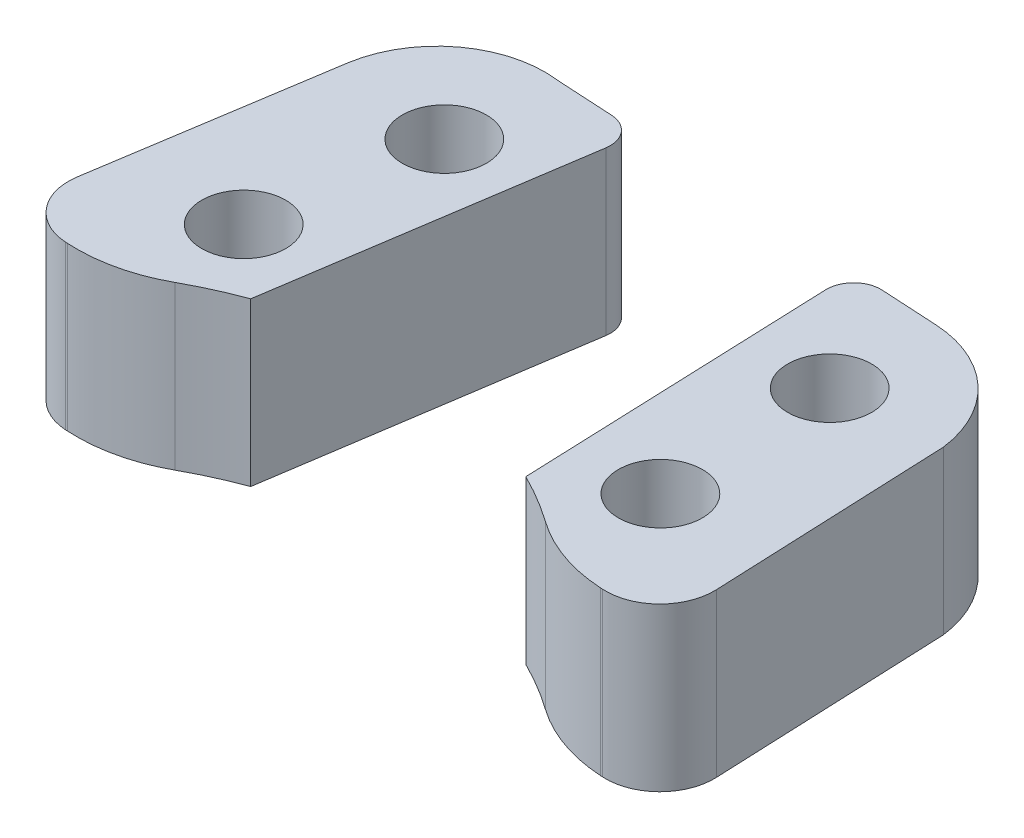
ISO-10303-21;
HEADER;
FILE_DESCRIPTION(('STEP AP214'),'2;1');
FILE_NAME('part.step','',(''),(''),'','','');
FILE_SCHEMA(('AUTOMOTIVE_DESIGN { 1 0 10303 214 1 1 1 1 }'));
ENDSEC;
DATA;
#1=APPLICATION_CONTEXT('core data for automotive mechanical design processes');
#2=APPLICATION_PROTOCOL_DEFINITION('international standard','automotive_design',2000,#1);
#3=PRODUCT_CONTEXT('',#1,'mechanical');
#4=PRODUCT('Part','Part','',(#3));
#5=PRODUCT_RELATED_PRODUCT_CATEGORY('part','',(#4));
#6=PRODUCT_DEFINITION_FORMATION('','',#4);
#7=PRODUCT_DEFINITION_CONTEXT('part definition',#1,'design');
#8=PRODUCT_DEFINITION('design','',#6,#7);
#9=PRODUCT_DEFINITION_SHAPE('','',#8);
#10=(LENGTH_UNIT() NAMED_UNIT(*) SI_UNIT(.MILLI.,.METRE.));
#11=(NAMED_UNIT(*) PLANE_ANGLE_UNIT() SI_UNIT($,.RADIAN.));
#12=(NAMED_UNIT(*) SI_UNIT($,.STERADIAN.) SOLID_ANGLE_UNIT());
#13=UNCERTAINTY_MEASURE_WITH_UNIT(LENGTH_MEASURE(1.E-05),#10,'distance_accuracy_value','');
#14=(GEOMETRIC_REPRESENTATION_CONTEXT(3) GLOBAL_UNCERTAINTY_ASSIGNED_CONTEXT((#13)) GLOBAL_UNIT_ASSIGNED_CONTEXT((#10,
#11,#12)) REPRESENTATION_CONTEXT('',''));
#15=CARTESIAN_POINT('',(0.,0.,0.));
#16=DIRECTION('',(0.,0.,1.));
#17=DIRECTION('',(1.,0.,0.));
#18=AXIS2_PLACEMENT_3D('',#15,#16,#17);
#19=CARTESIAN_POINT('',(-365.184982718932,-12.8739937166285,59.1622427305003));
#20=DIRECTION('',(0.0562835978852173,0.,-0.998414821909759));
#21=DIRECTION('',(-0.998414821909759,0.,-0.0562835978852173));
#22=AXIS2_PLACEMENT_3D('',#19,#20,#21);
#23=PLANE('',#22);
#24=DIRECTION('',(0.998414821909759,0.,0.0562835978852173));
#25=VECTOR('',#24,1.);
#26=CARTESIAN_POINT('',(-365.184982718932,-18.8739937166285,59.1622427305003));
#27=LINE('',#26,#25);
#28=CARTESIAN_POINT('',(-365.184982718932,-18.8739937166285,59.1622427305003));
#29=VERTEX_POINT('',#28);
#30=CARTESIAN_POINT('',(-363.081307119284,-18.8739937166285,59.280833148965));
#31=VERTEX_POINT('',#30);
#32=EDGE_CURVE('E198',#29,#31,#27,.T.);
#33=ORIENTED_EDGE('',*,*,#32,.F.);
#34=DIRECTION('',(0.,-1.,0.));
#35=VECTOR('',#34,1.);
#36=CARTESIAN_POINT('',(-365.184982718932,-12.8739937166285,59.1622427305003));
#37=LINE('',#36,#35);
#38=CARTESIAN_POINT('',(-365.184982718932,-12.8739937166285,59.1622427305003));
#39=VERTEX_POINT('',#38);
#40=EDGE_CURVE('E12',#39,#29,#37,.T.);
#41=ORIENTED_EDGE('',*,*,#40,.F.);
#42=DIRECTION('',(0.998414821909734,0.,0.0562835978856571));
#43=VECTOR('',#42,1.);
#44=CARTESIAN_POINT('',(-363.485411584869,-12.8739937166285,59.2580525844686));
#45=LINE('',#44,#43);
#46=CARTESIAN_POINT('',(-363.081307119284,-12.8739937166285,59.280833148965));
#47=VERTEX_POINT('',#46);
#48=EDGE_CURVE('E74',#39,#47,#45,.T.);
#49=ORIENTED_EDGE('',*,*,#48,.T.);
#50=DIRECTION('',(0.,-1.,0.));
#51=VECTOR('',#50,1.);
#52=CARTESIAN_POINT('',(-363.081307119284,-12.8739937166285,59.280833148965));
#53=LINE('',#52,#51);
#54=EDGE_CURVE('E55',#47,#31,#53,.T.);
#55=ORIENTED_EDGE('',*,*,#54,.T.);
#56=EDGE_LOOP('',(#33,#41,#49,#55));
#57=FACE_BOUND('',#56,.T.);
#58=ADVANCED_FACE('F51',(#57),#23,.T.);
#59=CARTESIAN_POINT('',(-365.241266316817,-12.8739937166285,60.1606575524101));
#60=DIRECTION('',(0.,-1.,0.));
#61=DIRECTION('',(0.,0.,-1.));
#62=AXIS2_PLACEMENT_3D('',#59,#60,#61);
#63=CYLINDRICAL_SURFACE('',#62,1.00000000000003);
#64=CARTESIAN_POINT('',(-365.241266316817,-18.8739937166285,60.1606575524101));
#65=DIRECTION('',(0.,-1.,0.));
#66=DIRECTION('',(0.,0.,-1.));
#67=AXIS2_PLACEMENT_3D('',#64,#65,#66);
#68=CIRCLE('',#67,1.00000000000003);
#69=CARTESIAN_POINT('',(-366.240537330951,-18.8739937166285,60.1988339890037));
#70=VERTEX_POINT('',#69);
#71=EDGE_CURVE('E195',#70,#29,#68,.T.);
#72=ORIENTED_EDGE('',*,*,#71,.F.);
#73=DIRECTION('',(0.,-1.,0.));
#74=VECTOR('',#73,1.);
#75=CARTESIAN_POINT('',(-366.240537330951,-12.8739937166285,60.1988339890037));
#76=LINE('',#75,#74);
#77=CARTESIAN_POINT('',(-366.240537330951,-12.8739937166285,60.1988339890037));
#78=VERTEX_POINT('',#77);
#79=EDGE_CURVE('E62',#78,#70,#76,.T.);
#80=ORIENTED_EDGE('',*,*,#79,.F.);
#81=CARTESIAN_POINT('',(-365.241266316817,-12.8739937166285,60.1606575524101));
#82=DIRECTION('',(0.,-1.,0.));
#83=DIRECTION('',(0.,0.,-1.));
#84=AXIS2_PLACEMENT_3D('',#81,#82,#83);
#85=CIRCLE('',#84,1.00000000000003);
#86=EDGE_CURVE('E158',#78,#39,#85,.T.);
#87=ORIENTED_EDGE('',*,*,#86,.T.);
#88=ORIENTED_EDGE('',*,*,#40,.T.);
#89=EDGE_LOOP('',(#72,#80,#87,#88));
#90=FACE_BOUND('',#89,.T.);
#91=ADVANCED_FACE('F220',(#90),#63,.T.);
#92=CARTESIAN_POINT('',(-366.240537330951,-12.8739937166285,60.1988339890037));
#93=DIRECTION('',(-0.999271014134308,0.,0.0381764365936752));
#94=DIRECTION('',(0.0381764365936752,0.,0.999271014134309));
#95=AXIS2_PLACEMENT_3D('',#92,#93,#94);
#96=PLANE('',#95);
#97=DIRECTION('',(-0.0381764365936752,0.,-0.999271014134308));
#98=VECTOR('',#97,1.);
#99=CARTESIAN_POINT('',(-366.240537330951,-18.8739937166285,60.1988339890037));
#100=LINE('',#99,#98);
#101=CARTESIAN_POINT('',(-365.801162734711,-18.8739937166286,71.6994961132229));
#102=VERTEX_POINT('',#101);
#103=EDGE_CURVE('E145',#102,#70,#100,.T.);
#104=ORIENTED_EDGE('',*,*,#103,.F.);
#105=DIRECTION('',(0.,-1.,0.));
#106=VECTOR('',#105,1.);
#107=CARTESIAN_POINT('',(-365.801162734711,-12.8739937166286,71.6994961132229));
#108=LINE('',#107,#106);
#109=CARTESIAN_POINT('',(-365.801162734711,-12.8739937166286,71.6994961132229));
#110=VERTEX_POINT('',#109);
#111=EDGE_CURVE('E140',#110,#102,#108,.T.);
#112=ORIENTED_EDGE('',*,*,#111,.F.);
#113=DIRECTION('',(-0.0381764365936752,0.,-0.999271014134308));
#114=VECTOR('',#113,1.);
#115=CARTESIAN_POINT('',(-366.240537330951,-12.8739937166285,60.1988339890037));
#116=LINE('',#115,#114);
#117=EDGE_CURVE('E143',#110,#78,#116,.T.);
#118=ORIENTED_EDGE('',*,*,#117,.T.);
#119=ORIENTED_EDGE('',*,*,#79,.T.);
#120=EDGE_LOOP('',(#104,#112,#118,#119));
#121=FACE_BOUND('',#120,.T.);
#122=ADVANCED_FACE('F142',(#121),#96,.T.);
#123=CARTESIAN_POINT('',(-371.888147249356,-12.8739937166286,83.944033655527));
#124=DIRECTION('',(0.,-1.,0.));
#125=DIRECTION('',(0.,0.,-1.));
#126=AXIS2_PLACEMENT_3D('',#123,#124,#125);
#127=CYLINDRICAL_SURFACE('',#126,13.6740659683367);
#128=CARTESIAN_POINT('',(-371.888147249356,-18.8739937166286,83.944033655527));
#129=DIRECTION('',(0.,1.,0.));
#130=DIRECTION('',(0.,0.,-1.));
#131=AXIS2_PLACEMENT_3D('',#128,#129,#130);
#132=CIRCLE('',#131,13.6740659683367);
#133=CARTESIAN_POINT('',(-363.989579113715,-18.8739937166286,72.7819235721663));
#134=VERTEX_POINT('',#133);
#135=EDGE_CURVE('E190',#134,#102,#132,.T.);
#136=ORIENTED_EDGE('',*,*,#135,.F.);
#137=DIRECTION('',(0.,-1.,0.));
#138=VECTOR('',#137,1.);
#139=CARTESIAN_POINT('',(-363.989579113715,-12.8739937166286,72.7819235721663));
#140=LINE('',#139,#138);
#141=CARTESIAN_POINT('',(-363.989579113715,-12.8739937166286,72.7819235721663));
#142=VERTEX_POINT('',#141);
#143=EDGE_CURVE('E151',#142,#134,#140,.T.);
#144=ORIENTED_EDGE('',*,*,#143,.F.);
#145=CARTESIAN_POINT('',(-371.888147249356,-12.8739937166286,83.944033655527));
#146=DIRECTION('',(0.,1.,0.));
#147=DIRECTION('',(0.,0.,-1.));
#148=AXIS2_PLACEMENT_3D('',#145,#146,#147);
#149=CIRCLE('',#148,13.6740659683367);
#150=EDGE_CURVE('E156',#142,#110,#149,.T.);
#151=ORIENTED_EDGE('',*,*,#150,.T.);
#152=ORIENTED_EDGE('',*,*,#111,.T.);
#153=EDGE_LOOP('',(#136,#144,#151,#152));
#154=FACE_BOUND('',#153,.T.);
#155=ADVANCED_FACE('F161',(#154),#127,.F.);
#156=CARTESIAN_POINT('',(-360.523791474282,-12.8739937166286,67.8841367211123));
#157=DIRECTION('',(0.,-1.,0.));
#158=DIRECTION('',(0.,0.,-1.));
#159=AXIS2_PLACEMENT_3D('',#156,#157,#158);
#160=CYLINDRICAL_SURFACE('',#159,6.00000000000003);
#161=CARTESIAN_POINT('',(-360.523791474282,-18.8739937166286,67.8841367211123));
#162=DIRECTION('',(0.,-1.,0.));
#163=DIRECTION('',(0.,0.,-1.));
#164=AXIS2_PLACEMENT_3D('',#161,#162,#163);
#165=CIRCLE('',#164,6.00000000000003);
#166=CARTESIAN_POINT('',(-360.861493061597,-18.8739937166286,73.8746256525707));
#167=VERTEX_POINT('',#166);
#168=EDGE_CURVE('E187',#167,#134,#165,.T.);
#169=ORIENTED_EDGE('',*,*,#168,.F.);
#170=DIRECTION('',(0.,-1.,0.));
#171=VECTOR('',#170,1.);
#172=CARTESIAN_POINT('',(-360.861493061597,-12.8739937166286,73.8746256525707));
#173=LINE('',#172,#171);
#174=CARTESIAN_POINT('',(-360.861493061597,-12.8739937166286,73.8746256525707));
#175=VERTEX_POINT('',#174);
#176=EDGE_CURVE('E204',#175,#167,#173,.T.);
#177=ORIENTED_EDGE('',*,*,#176,.F.);
#178=CARTESIAN_POINT('',(-360.523791474282,-12.8739937166286,67.8841367211123));
#179=DIRECTION('',(0.,-1.,0.));
#180=DIRECTION('',(0.,0.,-1.));
#181=AXIS2_PLACEMENT_3D('',#178,#179,#180);
#182=CIRCLE('',#181,6.00000000000003);
#183=EDGE_CURVE('E163',#175,#142,#182,.T.);
#184=ORIENTED_EDGE('',*,*,#183,.T.);
#185=ORIENTED_EDGE('',*,*,#143,.T.);
#186=EDGE_LOOP('',(#169,#177,#184,#185));
#187=FACE_BOUND('',#186,.T.);
#188=ADVANCED_FACE('F233',(#187),#160,.T.);
#189=CARTESIAN_POINT('',(-360.782849254436,-12.8739937166286,73.8790590366926));
#190=DIRECTION('',(-0.056283597887145,0.,0.99841482190965));
#191=DIRECTION('',(0.99841482190965,0.,0.056283597887145));
#192=AXIS2_PLACEMENT_3D('',#189,#190,#191);
#193=PLANE('',#192);
#194=DIRECTION('',(-0.99841482190965,0.,-0.056283597887145));
#195=VECTOR('',#194,1.);
#196=CARTESIAN_POINT('',(-360.782849254436,-18.8739937166286,73.8790590366926));
#197=LINE('',#196,#195);
#198=CARTESIAN_POINT('',(-360.782849254436,-18.8739937166286,73.8790590366926));
#199=VERTEX_POINT('',#198);
#200=EDGE_CURVE('E184',#199,#167,#197,.T.);
#201=ORIENTED_EDGE('',*,*,#200,.F.);
#202=DIRECTION('',(0.,-1.,0.));
#203=VECTOR('',#202,1.);
#204=CARTESIAN_POINT('',(-360.782849254436,-12.8739937166286,73.8790590366926));
#205=LINE('',#204,#203);
#206=CARTESIAN_POINT('',(-360.782849254436,-12.8739937166286,73.8790590366926));
#207=VERTEX_POINT('',#206);
#208=EDGE_CURVE('E206',#207,#199,#205,.T.);
#209=ORIENTED_EDGE('',*,*,#208,.F.);
#210=DIRECTION('',(-0.99841482190965,0.,-0.056283597887145));
#211=VECTOR('',#210,1.);
#212=CARTESIAN_POINT('',(-360.782849254436,-12.8739937166286,73.8790590366926));
#213=LINE('',#212,#211);
#214=EDGE_CURVE('E167',#207,#175,#213,.T.);
#215=ORIENTED_EDGE('',*,*,#214,.T.);
#216=ORIENTED_EDGE('',*,*,#176,.T.);
#217=EDGE_LOOP('',(#201,#209,#215,#216));
#218=FACE_BOUND('',#217,.T.);
#219=ADVANCED_FACE('F236',(#218),#193,.T.);
#220=CARTESIAN_POINT('',(-360.670282058665,-12.8739937166286,71.882229392873));
#221=DIRECTION('',(0.,-1.,0.));
#222=DIRECTION('',(0.,0.,-1.));
#223=AXIS2_PLACEMENT_3D('',#220,#221,#222);
#224=CYLINDRICAL_SURFACE('',#223,2.00000000000014);
#225=CARTESIAN_POINT('',(-360.670282058665,-18.8739937166286,71.882229392873));
#226=DIRECTION('',(0.,-1.,0.));
#227=DIRECTION('',(0.,0.,-1.));
#228=AXIS2_PLACEMENT_3D('',#225,#226,#227);
#229=CIRCLE('',#228,2.00000000000014);
#230=CARTESIAN_POINT('',(-358.672053269512,-18.8739937166286,71.7980765188907));
#231=VERTEX_POINT('',#230);
#232=EDGE_CURVE('E181',#231,#199,#229,.T.);
#233=ORIENTED_EDGE('',*,*,#232,.F.);
#234=DIRECTION('',(0.,-1.,0.));
#235=VECTOR('',#234,1.);
#236=CARTESIAN_POINT('',(-358.672053269512,-12.8739937166286,71.7980765188907));
#237=LINE('',#236,#235);
#238=CARTESIAN_POINT('',(-358.672053269512,-12.8739937166286,71.7980765188907));
#239=VERTEX_POINT('',#238);
#240=EDGE_CURVE('E208',#239,#231,#237,.T.);
#241=ORIENTED_EDGE('',*,*,#240,.F.);
#242=CARTESIAN_POINT('',(-360.670282058665,-12.8739937166286,71.882229392873));
#243=DIRECTION('',(0.,-1.,0.));
#244=DIRECTION('',(0.,0.,-1.));
#245=AXIS2_PLACEMENT_3D('',#242,#243,#244);
#246=CIRCLE('',#245,2.00000000000014);
#247=EDGE_CURVE('E260',#239,#207,#246,.T.);
#248=ORIENTED_EDGE('',*,*,#247,.T.);
#249=ORIENTED_EDGE('',*,*,#208,.T.);
#250=EDGE_LOOP('',(#233,#241,#248,#249));
#251=FACE_BOUND('',#250,.T.);
#252=ADVANCED_FACE('F240',(#251),#224,.T.);
#253=CARTESIAN_POINT('',(-359.040446778696,-12.8739937166285,63.0504903587098));
#254=DIRECTION('',(0.999114394576576,0.,-0.0420764369912857));
#255=DIRECTION('',(-0.0420764369912857,0.,-0.999114394576576));
#256=AXIS2_PLACEMENT_3D('',#253,#254,#255);
#257=PLANE('',#256);
#258=DIRECTION('',(0.0420764369912857,0.,0.999114394576576));
#259=VECTOR('',#258,1.);
#260=CARTESIAN_POINT('',(-359.040446778696,-18.8739937166285,63.0504903587098));
#261=LINE('',#260,#259);
#262=CARTESIAN_POINT('',(-359.040446778696,-18.8739937166285,63.0504903587098));
#263=VERTEX_POINT('',#262);
#264=EDGE_CURVE('E177',#263,#231,#261,.T.);
#265=ORIENTED_EDGE('',*,*,#264,.F.);
#266=DIRECTION('',(0.,-1.,0.));
#267=VECTOR('',#266,1.);
#268=CARTESIAN_POINT('',(-359.040446778696,-12.8739937166285,63.0504903587098));
#269=LINE('',#268,#267);
#270=CARTESIAN_POINT('',(-359.040446778696,-12.8739937166285,63.0504903587098));
#271=VERTEX_POINT('',#270);
#272=EDGE_CURVE('E209',#271,#263,#269,.T.);
#273=ORIENTED_EDGE('',*,*,#272,.F.);
#274=DIRECTION('',(0.0420764369912857,0.,0.999114394576576));
#275=VECTOR('',#274,1.);
#276=CARTESIAN_POINT('',(-359.040446778696,-12.8739937166285,63.0504903587098));
#277=LINE('',#276,#275);
#278=EDGE_CURVE('E253',#271,#239,#277,.T.);
#279=ORIENTED_EDGE('',*,*,#278,.T.);
#280=ORIENTED_EDGE('',*,*,#240,.T.);
#281=EDGE_LOOP('',(#265,#273,#279,#280));
#282=FACE_BOUND('',#281,.T.);
#283=ADVANCED_FACE('F243',(#282),#257,.T.);
#284=CARTESIAN_POINT('',(-363.324338378626,-12.8739937166285,63.5919649996129));
#285=DIRECTION('',(0.,-1.,0.));
#286=DIRECTION('',(0.,0.,-1.));
#287=AXIS2_PLACEMENT_3D('',#284,#285,#286);
#288=CYLINDRICAL_SURFACE('',#287,4.31797661256841);
#289=CARTESIAN_POINT('',(-363.324338378626,-18.8739937166285,63.5919649996129));
#290=DIRECTION('',(0.,-1.,0.));
#291=DIRECTION('',(0.,0.,-1.));
#292=AXIS2_PLACEMENT_3D('',#289,#290,#291);
#293=CIRCLE('',#292,4.31797661256841);
#294=EDGE_CURVE('E173',#31,#263,#293,.T.);
#295=ORIENTED_EDGE('',*,*,#294,.F.);
#296=ORIENTED_EDGE('',*,*,#54,.F.);
#297=CARTESIAN_POINT('',(-363.324338378626,-12.8739937166285,63.5919649996129));
#298=DIRECTION('',(0.,-1.,0.));
#299=DIRECTION('',(0.,0.,-1.));
#300=AXIS2_PLACEMENT_3D('',#297,#298,#299);
#301=CIRCLE('',#300,4.31797661256841);
#302=EDGE_CURVE('E262',#47,#271,#301,.T.);
#303=ORIENTED_EDGE('',*,*,#302,.T.);
#304=ORIENTED_EDGE('',*,*,#272,.T.);
#305=EDGE_LOOP('',(#295,#296,#303,#304));
#306=FACE_BOUND('',#305,.T.);
#307=ADVANCED_FACE('F53',(#306),#288,.T.);
#308=CARTESIAN_POINT('',(-363.324338378626,-12.8739937166285,63.5919649996129));
#309=DIRECTION('',(0.,-1.,0.));
#310=DIRECTION('',(0.,0.,-1.));
#311=AXIS2_PLACEMENT_3D('',#308,#309,#310);
#312=PLANE('',#311);
#313=CARTESIAN_POINT('',(-363.021125314256,-12.8739937166285,63.2652571905117));
#314=DIRECTION('',(0.,1.,0.));
#315=DIRECTION('',(0.,0.,1.));
#316=AXIS2_PLACEMENT_3D('',#313,#314,#315);
#317=CIRCLE('',#316,1.55000000000031);
#318=CARTESIAN_POINT('',(-363.021125314256,-12.8739937166285,64.815257190512));
#319=VERTEX_POINT('',#318);
#320=EDGE_CURVE('E275',#319,#319,#317,.T.);
#321=ORIENTED_EDGE('',*,*,#320,.F.);
#322=EDGE_LOOP('',(#321));
#323=FACE_BOUND('',#322,.T.);
#324=CARTESIAN_POINT('',(-362.772978476397,-12.8739937166286,69.7605187823847));
#325=DIRECTION('',(0.,1.,0.));
#326=DIRECTION('',(0.,0.,1.));
#327=AXIS2_PLACEMENT_3D('',#324,#325,#326);
#328=CIRCLE('',#327,1.55000000000031);
#329=CARTESIAN_POINT('',(-362.772978476397,-12.8739937166286,71.310518782385));
#330=VERTEX_POINT('',#329);
#331=EDGE_CURVE('E267',#330,#330,#328,.T.);
#332=ORIENTED_EDGE('',*,*,#331,.F.);
#333=EDGE_LOOP('',(#332));
#334=FACE_BOUND('',#333,.T.);
#335=ORIENTED_EDGE('',*,*,#48,.F.);
#336=ORIENTED_EDGE('',*,*,#86,.F.);
#337=ORIENTED_EDGE('',*,*,#117,.F.);
#338=ORIENTED_EDGE('',*,*,#150,.F.);
#339=ORIENTED_EDGE('',*,*,#183,.F.);
#340=ORIENTED_EDGE('',*,*,#214,.F.);
#341=ORIENTED_EDGE('',*,*,#247,.F.);
#342=ORIENTED_EDGE('',*,*,#278,.F.);
#343=ORIENTED_EDGE('',*,*,#302,.F.);
#344=EDGE_LOOP('',(#335,#336,#337,#338,#339,#340,#341,#342,#343));
#345=FACE_BOUND('',#344,.T.);
#346=ADVANCED_FACE('F154',(#323,#334,#345),#312,.F.);
#347=CARTESIAN_POINT('',(-363.324338378626,-18.8739937166285,63.5919649996129));
#348=DIRECTION('',(0.,-1.,0.));
#349=DIRECTION('',(0.,0.,-1.));
#350=AXIS2_PLACEMENT_3D('',#347,#348,#349);
#351=PLANE('',#350);
#352=CARTESIAN_POINT('',(-363.021125314256,-18.8739937166285,63.2652571905117));
#353=DIRECTION('',(0.,1.,0.));
#354=DIRECTION('',(0.,0.,1.));
#355=AXIS2_PLACEMENT_3D('',#352,#353,#354);
#356=CIRCLE('',#355,1.55000000000031);
#357=CARTESIAN_POINT('',(-363.021125314256,-18.8739937166285,64.815257190512));
#358=VERTEX_POINT('',#357);
#359=EDGE_CURVE('E178',#358,#358,#356,.T.);
#360=ORIENTED_EDGE('',*,*,#359,.T.);
#361=EDGE_LOOP('',(#360));
#362=FACE_BOUND('',#361,.T.);
#363=CARTESIAN_POINT('',(-362.772978476397,-18.8739937166286,69.7605187823847));
#364=DIRECTION('',(0.,1.,0.));
#365=DIRECTION('',(0.,0.,1.));
#366=AXIS2_PLACEMENT_3D('',#363,#364,#365);
#367=CIRCLE('',#366,1.55000000000031);
#368=CARTESIAN_POINT('',(-362.772978476397,-18.8739937166286,71.310518782385));
#369=VERTEX_POINT('',#368);
#370=EDGE_CURVE('E271',#369,#369,#367,.T.);
#371=ORIENTED_EDGE('',*,*,#370,.T.);
#372=EDGE_LOOP('',(#371));
#373=FACE_BOUND('',#372,.T.);
#374=ORIENTED_EDGE('',*,*,#32,.T.);
#375=ORIENTED_EDGE('',*,*,#294,.T.);
#376=ORIENTED_EDGE('',*,*,#264,.T.);
#377=ORIENTED_EDGE('',*,*,#232,.T.);
#378=ORIENTED_EDGE('',*,*,#200,.T.);
#379=ORIENTED_EDGE('',*,*,#168,.T.);
#380=ORIENTED_EDGE('',*,*,#135,.T.);
#381=ORIENTED_EDGE('',*,*,#103,.T.);
#382=ORIENTED_EDGE('',*,*,#71,.T.);
#383=EDGE_LOOP('',(#374,#375,#376,#377,#378,#379,#380,#381,#382));
#384=FACE_BOUND('',#383,.T.);
#385=ADVANCED_FACE('F219',(#362,#373,#384),#351,.T.);
#386=CARTESIAN_POINT('',(-362.772978476397,-18.8739937166286,69.7605187823847));
#387=DIRECTION('',(0.,1.,0.));
#388=DIRECTION('',(0.,0.,1.));
#389=AXIS2_PLACEMENT_3D('',#386,#387,#388);
#390=CYLINDRICAL_SURFACE('',#389,1.55000000000031);
#391=ORIENTED_EDGE('',*,*,#370,.F.);
#392=EDGE_LOOP('',(#391));
#393=FACE_BOUND('',#392,.T.);
#394=ORIENTED_EDGE('',*,*,#331,.T.);
#395=EDGE_LOOP('',(#394));
#396=FACE_BOUND('',#395,.T.);
#397=ADVANCED_FACE('F288',(#393,#396),#390,.F.);
#398=CARTESIAN_POINT('',(-363.021125314256,-18.8739937166285,63.2652571905117));
#399=DIRECTION('',(0.,1.,0.));
#400=DIRECTION('',(0.,0.,1.));
#401=AXIS2_PLACEMENT_3D('',#398,#399,#400);
#402=CYLINDRICAL_SURFACE('',#401,1.55000000000031);
#403=ORIENTED_EDGE('',*,*,#359,.F.);
#404=EDGE_LOOP('',(#403));
#405=FACE_BOUND('',#404,.T.);
#406=ORIENTED_EDGE('',*,*,#320,.T.);
#407=EDGE_LOOP('',(#406));
#408=FACE_BOUND('',#407,.T.);
#409=ADVANCED_FACE('F285',(#405,#408),#402,.F.);
#410=CLOSED_SHELL('',(#58,#91,#122,#155,#188,#219,#252,#283,#307,#346,#385,#397,#409));
#411=MANIFOLD_SOLID_BREP('B2',#410);
#412=CARTESIAN_POINT('',(-371.888147249356,-12.8739937166286,83.944033655527));
#413=DIRECTION('',(0.,-1.,0.));
#414=DIRECTION('',(0.,0.,-1.));
#415=AXIS2_PLACEMENT_3D('',#412,#413,#414);
#416=CYLINDRICAL_SURFACE('',#415,13.6740659683367);
#417=CARTESIAN_POINT('',(-371.888147249356,-18.8739937166286,83.944033655527));
#418=DIRECTION('',(0.,1.,0.));
#419=DIRECTION('',(0.,0.,-1.));
#420=AXIS2_PLACEMENT_3D('',#417,#418,#419);
#421=CIRCLE('',#420,13.6740659683367);
#422=CARTESIAN_POINT('',(-376.560022786574,-18.8739937166286,71.0928212974978));
#423=VERTEX_POINT('',#422);
#424=CARTESIAN_POINT('',(-378.482176856634,-18.8739937166286,71.9649329528548));
#425=VERTEX_POINT('',#424);
#426=EDGE_CURVE('E496',#423,#425,#421,.T.);
#427=ORIENTED_EDGE('',*,*,#426,.F.);
#428=DIRECTION('',(0.,-1.,0.));
#429=VECTOR('',#428,1.);
#430=CARTESIAN_POINT('',(-376.560022786574,-12.8739937166286,71.0928212974978));
#431=LINE('',#430,#429);
#432=CARTESIAN_POINT('',(-376.560022786574,-12.8739937166286,71.0928212974978));
#433=VERTEX_POINT('',#432);
#434=EDGE_CURVE('E49',#433,#423,#431,.T.);
#435=ORIENTED_EDGE('',*,*,#434,.F.);
#436=CARTESIAN_POINT('',(-371.888147249356,-12.8739937166286,83.944033655527));
#437=DIRECTION('',(0.,1.,0.));
#438=DIRECTION('',(0.,0.,-1.));
#439=AXIS2_PLACEMENT_3D('',#436,#437,#438);
#440=CIRCLE('',#439,13.6740659683367);
#441=CARTESIAN_POINT('',(-378.482176856634,-12.8739937166286,71.9649329528548));
#442=VERTEX_POINT('',#441);
#443=EDGE_CURVE('E523',#433,#442,#440,.T.);
#444=ORIENTED_EDGE('',*,*,#443,.T.);
#445=DIRECTION('',(0.,-1.,0.));
#446=VECTOR('',#445,1.);
#447=CARTESIAN_POINT('',(-378.482176856634,-12.8739937166286,71.9649329528548));
#448=LINE('',#447,#446);
#449=EDGE_CURVE('E387',#442,#425,#448,.T.);
#450=ORIENTED_EDGE('',*,*,#449,.T.);
#451=EDGE_LOOP('',(#427,#435,#444,#450));
#452=FACE_BOUND('',#451,.T.);
#453=ADVANCED_FACE('F384',(#452),#416,.F.);
#454=CARTESIAN_POINT('',(-376.560022786574,-12.8739937166286,71.0928212974978));
#455=DIRECTION('',(0.988652507251544,0.,0.150220570845792));
#456=DIRECTION('',(0.150220570845792,0.,-0.988652507251544));
#457=AXIS2_PLACEMENT_3D('',#454,#455,#456);
#458=PLANE('',#457);
#459=DIRECTION('',(-0.150220570845792,0.,0.988652507251544));
#460=VECTOR('',#459,1.);
#461=CARTESIAN_POINT('',(-376.560022786574,-18.8739937166286,71.0928212974978));
#462=LINE('',#461,#460);
#463=CARTESIAN_POINT('',(-374.831151717539,-18.8739937166285,59.7145346388041));
#464=VERTEX_POINT('',#463);
#465=EDGE_CURVE('E520',#464,#423,#462,.T.);
#466=ORIENTED_EDGE('',*,*,#465,.F.);
#467=DIRECTION('',(0.,-1.,0.));
#468=VECTOR('',#467,1.);
#469=CARTESIAN_POINT('',(-374.831151717539,-12.8739937166285,59.7145346388041));
#470=LINE('',#469,#468);
#471=CARTESIAN_POINT('',(-374.831151717539,-12.8739937166285,59.7145346388041));
#472=VERTEX_POINT('',#471);
#473=EDGE_CURVE('E393',#472,#464,#470,.T.);
#474=ORIENTED_EDGE('',*,*,#473,.F.);
#475=DIRECTION('',(-0.150220570845792,0.,0.988652507251544));
#476=VECTOR('',#475,1.);
#477=CARTESIAN_POINT('',(-376.560022786574,-12.8739937166286,71.0928212974978));
#478=LINE('',#477,#476);
#479=EDGE_CURVE('E488',#472,#433,#478,.T.);
#480=ORIENTED_EDGE('',*,*,#479,.T.);
#481=ORIENTED_EDGE('',*,*,#434,.T.);
#482=EDGE_LOOP('',(#466,#474,#480,#481));
#483=FACE_BOUND('',#482,.T.);
#484=ADVANCED_FACE('F539',(#483),#458,.T.);
#485=CARTESIAN_POINT('',(-375.819804224791,-12.8739937166285,59.5643140679583));
#486=DIRECTION('',(0.,-1.,0.));
#487=DIRECTION('',(0.,0.,-1.));
#488=AXIS2_PLACEMENT_3D('',#485,#486,#487);
#489=CYLINDRICAL_SURFACE('',#488,1.);
#490=CARTESIAN_POINT('',(-375.819804224791,-18.8739937166285,59.5643140679583));
#491=DIRECTION('',(0.,-1.,0.));
#492=DIRECTION('',(0.,0.,1.));
#493=AXIS2_PLACEMENT_3D('',#490,#491,#492);
#494=CIRCLE('',#493,1.);
#495=CARTESIAN_POINT('',(-375.763520626906,-18.8739937166285,58.5658992460486));
#496=VERTEX_POINT('',#495);
#497=EDGE_CURVE('E483',#496,#464,#494,.T.);
#498=ORIENTED_EDGE('',*,*,#497,.F.);
#499=DIRECTION('',(0.,-1.,0.));
#500=VECTOR('',#499,1.);
#501=CARTESIAN_POINT('',(-375.763520626906,-12.8739937166285,58.5658992460486));
#502=LINE('',#501,#500);
#503=CARTESIAN_POINT('',(-375.763520626906,-12.8739937166285,58.5658992460486));
#504=VERTEX_POINT('',#503);
#505=EDGE_CURVE('E470',#504,#496,#502,.T.);
#506=ORIENTED_EDGE('',*,*,#505,.F.);
#507=CARTESIAN_POINT('',(-375.819804224791,-12.8739937166285,59.5643140679583));
#508=DIRECTION('',(0.,-1.,0.));
#509=DIRECTION('',(0.,0.,1.));
#510=AXIS2_PLACEMENT_3D('',#507,#508,#509);
#511=CIRCLE('',#510,1.);
#512=EDGE_CURVE('E478',#504,#472,#511,.T.);
#513=ORIENTED_EDGE('',*,*,#512,.T.);
#514=ORIENTED_EDGE('',*,*,#473,.T.);
#515=EDGE_LOOP('',(#498,#506,#513,#514));
#516=FACE_BOUND('',#515,.T.);
#517=ADVANCED_FACE('F481',(#516),#489,.T.);
#518=CARTESIAN_POINT('',(-377.463219091604,-12.8739937166285,58.4700822140756));
#519=DIRECTION('',(0.0562835978852186,0.,-0.998414821909758));
#520=DIRECTION('',(-0.998414821909759,0.,-0.0562835978852186));
#521=AXIS2_PLACEMENT_3D('',#518,#519,#520);
#522=PLANE('',#521);
#523=DIRECTION('',(0.998414821909759,0.,0.0562835978852186));
#524=VECTOR('',#523,1.);
#525=CARTESIAN_POINT('',(-377.463219091604,-18.8739937166285,58.4700822140756));
#526=LINE('',#525,#524);
#527=CARTESIAN_POINT('',(-377.867323557188,-18.8739937166285,58.4473016495792));
#528=VERTEX_POINT('',#527);
#529=EDGE_CURVE('E515',#528,#496,#526,.T.);
#530=ORIENTED_EDGE('',*,*,#529,.F.);
#531=DIRECTION('',(0.,-1.,0.));
#532=VECTOR('',#531,1.);
#533=CARTESIAN_POINT('',(-377.867323557188,-12.8739937166285,58.4473016495792));
#534=LINE('',#533,#532);
#535=CARTESIAN_POINT('',(-377.867323557188,-12.8739937166285,58.4473016495792));
#536=VERTEX_POINT('',#535);
#537=EDGE_CURVE('E472',#536,#528,#534,.T.);
#538=ORIENTED_EDGE('',*,*,#537,.F.);
#539=DIRECTION('',(0.998414821909733,0.,0.0562835978856779));
#540=VECTOR('',#539,1.);
#541=CARTESIAN_POINT('',(-377.867323557188,-12.8739937166285,58.4473016495792));
#542=LINE('',#541,#540);
#543=EDGE_CURVE('E467',#536,#504,#542,.T.);
#544=ORIENTED_EDGE('',*,*,#543,.T.);
#545=ORIENTED_EDGE('',*,*,#505,.T.);
#546=EDGE_LOOP('',(#530,#538,#544,#545));
#547=FACE_BOUND('',#546,.T.);
#548=ADVANCED_FACE('F469',(#547),#522,.T.);
#549=CARTESIAN_POINT('',(-378.384912864813,-12.8739937166285,62.3881780115966));
#550=DIRECTION('',(0.,-1.,0.));
#551=DIRECTION('',(0.,0.,-1.));
#552=AXIS2_PLACEMENT_3D('',#549,#550,#551);
#553=CYLINDRICAL_SURFACE('',#552,3.97472076906982);
#554=CARTESIAN_POINT('',(-378.384912864813,-18.8739937166285,62.3881780115966));
#555=DIRECTION('',(0.,-1.,0.));
#556=DIRECTION('',(0.,0.,-1.));
#557=AXIS2_PLACEMENT_3D('',#554,#555,#556);
#558=CIRCLE('',#557,3.97472076906982);
#559=CARTESIAN_POINT('',(-382.306249359307,-18.8739937166285,61.7389282222087));
#560=VERTEX_POINT('',#559);
#561=EDGE_CURVE('E512',#560,#528,#558,.T.);
#562=ORIENTED_EDGE('',*,*,#561,.F.);
#563=DIRECTION('',(0.,-1.,0.));
#564=VECTOR('',#563,1.);
#565=CARTESIAN_POINT('',(-382.306249359307,-12.8739937166285,61.7389282222087));
#566=LINE('',#565,#564);
#567=CARTESIAN_POINT('',(-382.306249359307,-12.8739937166285,61.7389282222087));
#568=VERTEX_POINT('',#567);
#569=EDGE_CURVE('E528',#568,#560,#566,.T.);
#570=ORIENTED_EDGE('',*,*,#569,.F.);
#571=CARTESIAN_POINT('',(-378.384912864813,-12.8739937166285,62.3881780115966));
#572=DIRECTION('',(0.,-1.,0.));
#573=DIRECTION('',(0.,0.,-1.));
#574=AXIS2_PLACEMENT_3D('',#571,#572,#573);
#575=CIRCLE('',#574,3.97472076906982);
#576=EDGE_CURVE('E479',#568,#536,#575,.T.);
#577=ORIENTED_EDGE('',*,*,#576,.T.);
#578=ORIENTED_EDGE('',*,*,#537,.T.);
#579=EDGE_LOOP('',(#562,#570,#577,#578));
#580=FACE_BOUND('',#579,.T.);
#581=ADVANCED_FACE('F552',(#580),#553,.T.);
#582=CARTESIAN_POINT('',(-383.65543917544,-12.8739937166286,70.3896891279029));
#583=DIRECTION('',(-0.988055400272616,0.,-0.154099078492123));
#584=DIRECTION('',(-0.154099078492123,0.,0.988055400272616));
#585=AXIS2_PLACEMENT_3D('',#582,#583,#584);
#586=PLANE('',#585);
#587=DIRECTION('',(0.154099078492123,0.,-0.988055400272616));
#588=VECTOR('',#587,1.);
#589=CARTESIAN_POINT('',(-383.65543917544,-18.8739937166286,70.3896891279029));
#590=LINE('',#589,#588);
#591=CARTESIAN_POINT('',(-383.65543917544,-18.8739937166286,70.3896891279029));
#592=VERTEX_POINT('',#591);
#593=EDGE_CURVE('E509',#592,#560,#590,.T.);
#594=ORIENTED_EDGE('',*,*,#593,.F.);
#595=DIRECTION('',(0.,-1.,0.));
#596=VECTOR('',#595,1.);
#597=CARTESIAN_POINT('',(-383.65543917544,-12.8739937166286,70.3896891279029));
#598=LINE('',#597,#596);
#599=CARTESIAN_POINT('',(-383.65543917544,-12.8739937166286,70.3896891279029));
#600=VERTEX_POINT('',#599);
#601=EDGE_CURVE('E531',#600,#592,#598,.T.);
#602=ORIENTED_EDGE('',*,*,#601,.F.);
#603=DIRECTION('',(0.154099078492123,0.,-0.988055400272616));
#604=VECTOR('',#603,1.);
#605=CARTESIAN_POINT('',(-383.65543917544,-12.8739937166286,70.3896891279029));
#606=LINE('',#605,#604);
#607=EDGE_CURVE('E613',#600,#568,#606,.T.);
#608=ORIENTED_EDGE('',*,*,#607,.T.);
#609=ORIENTED_EDGE('',*,*,#569,.T.);
#610=EDGE_LOOP('',(#594,#602,#608,#609));
#611=FACE_BOUND('',#610,.T.);
#612=ADVANCED_FACE('F555',(#611),#586,.T.);
#613=CARTESIAN_POINT('',(-381.679328374895,-12.8739937166286,70.6978872848871));
#614=DIRECTION('',(0.,-1.,0.));
#615=DIRECTION('',(0.,0.,-1.));
#616=AXIS2_PLACEMENT_3D('',#613,#614,#615);
#617=CYLINDRICAL_SURFACE('',#616,1.99999999999999);
#618=CARTESIAN_POINT('',(-381.679328374895,-18.8739937166286,70.6978872848871));
#619=DIRECTION('',(0.,-1.,0.));
#620=DIRECTION('',(0.,0.,-1.));
#621=AXIS2_PLACEMENT_3D('',#618,#619,#620);
#622=CIRCLE('',#621,1.99999999999999);
#623=CARTESIAN_POINT('',(-381.791895570666,-18.8739937166286,72.6947169287066));
#624=VERTEX_POINT('',#623);
#625=EDGE_CURVE('E506',#624,#592,#622,.T.);
#626=ORIENTED_EDGE('',*,*,#625,.F.);
#627=DIRECTION('',(0.,-1.,0.));
#628=VECTOR('',#627,1.);
#629=CARTESIAN_POINT('',(-381.791895570666,-12.8739937166286,72.6947169287066));
#630=LINE('',#629,#628);
#631=CARTESIAN_POINT('',(-381.791895570666,-12.8739937166286,72.6947169287066));
#632=VERTEX_POINT('',#631);
#633=EDGE_CURVE('E533',#632,#624,#630,.T.);
#634=ORIENTED_EDGE('',*,*,#633,.F.);
#635=CARTESIAN_POINT('',(-381.679328374895,-12.8739937166286,70.6978872848871));
#636=DIRECTION('',(0.,-1.,0.));
#637=DIRECTION('',(0.,0.,-1.));
#638=AXIS2_PLACEMENT_3D('',#635,#636,#637);
#639=CIRCLE('',#638,1.99999999999999);
#640=EDGE_CURVE('E610',#632,#600,#639,.T.);
#641=ORIENTED_EDGE('',*,*,#640,.T.);
#642=ORIENTED_EDGE('',*,*,#601,.T.);
#643=EDGE_LOOP('',(#626,#634,#641,#642));
#644=FACE_BOUND('',#643,.T.);
#645=ADVANCED_FACE('F559',(#644),#617,.T.);
#646=CARTESIAN_POINT('',(-381.71325176358,-12.8739937166286,72.6991503128242));
#647=DIRECTION('',(-0.0562835978856439,0.,0.998414821909735));
#648=DIRECTION('',(0.998414821909735,0.,0.0562835978856439));
#649=AXIS2_PLACEMENT_3D('',#646,#647,#648);
#650=PLANE('',#649);
#651=DIRECTION('',(-0.998414821909735,0.,-0.0562835978856439));
#652=VECTOR('',#651,1.);
#653=CARTESIAN_POINT('',(-381.71325176358,-18.8739937166286,72.6991503128242));
#654=LINE('',#653,#652);
#655=CARTESIAN_POINT('',(-381.71325176358,-18.8739937166286,72.6991503128242));
#656=VERTEX_POINT('',#655);
#657=EDGE_CURVE('E503',#656,#624,#654,.T.);
#658=ORIENTED_EDGE('',*,*,#657,.F.);
#659=DIRECTION('',(0.,-1.,0.));
#660=VECTOR('',#659,1.);
#661=CARTESIAN_POINT('',(-381.71325176358,-12.8739937166286,72.6991503128242));
#662=LINE('',#661,#660);
#663=CARTESIAN_POINT('',(-381.71325176358,-12.8739937166286,72.6991503128242));
#664=VERTEX_POINT('',#663);
#665=EDGE_CURVE('E534',#664,#656,#662,.T.);
#666=ORIENTED_EDGE('',*,*,#665,.F.);
#667=DIRECTION('',(-0.998414821909735,0.,-0.0562835978856439));
#668=VECTOR('',#667,1.);
#669=CARTESIAN_POINT('',(-381.71325176358,-12.8739937166286,72.6991503128242));
#670=LINE('',#669,#668);
#671=EDGE_CURVE('E607',#664,#632,#670,.T.);
#672=ORIENTED_EDGE('',*,*,#671,.T.);
#673=ORIENTED_EDGE('',*,*,#633,.T.);
#674=EDGE_LOOP('',(#658,#666,#672,#673));
#675=FACE_BOUND('',#674,.T.);
#676=ADVANCED_FACE('F563',(#675),#650,.T.);
#677=CARTESIAN_POINT('',(-381.375550176266,-12.8739937166285,66.7086613813658));
#678=DIRECTION('',(0.,-1.,0.));
#679=DIRECTION('',(0.,0.,-1.));
#680=AXIS2_PLACEMENT_3D('',#677,#678,#679);
#681=CYLINDRICAL_SURFACE('',#680,6.00000000000004);
#682=CARTESIAN_POINT('',(-381.375550176266,-18.8739937166285,66.7086613813658));
#683=DIRECTION('',(0.,-1.,0.));
#684=DIRECTION('',(0.,0.,-1.));
#685=AXIS2_PLACEMENT_3D('',#682,#683,#684);
#686=CIRCLE('',#685,6.00000000000004);
#687=EDGE_CURVE('E499',#425,#656,#686,.T.);
#688=ORIENTED_EDGE('',*,*,#687,.F.);
#689=ORIENTED_EDGE('',*,*,#449,.F.);
#690=CARTESIAN_POINT('',(-381.375550176266,-12.8739937166285,66.7086613813658));
#691=DIRECTION('',(0.,-1.,0.));
#692=DIRECTION('',(0.,0.,-1.));
#693=AXIS2_PLACEMENT_3D('',#690,#691,#692);
#694=CIRCLE('',#693,6.00000000000004);
#695=EDGE_CURVE('E605',#442,#664,#694,.T.);
#696=ORIENTED_EDGE('',*,*,#695,.T.);
#697=ORIENTED_EDGE('',*,*,#665,.T.);
#698=EDGE_LOOP('',(#688,#689,#696,#697));
#699=FACE_BOUND('',#698,.T.);
#700=ADVANCED_FACE('F536',(#699),#681,.T.);
#701=CARTESIAN_POINT('',(-371.888147249356,-12.8739937166286,83.944033655527));
#702=DIRECTION('',(0.,-1.,0.));
#703=DIRECTION('',(0.,0.,-1.));
#704=AXIS2_PLACEMENT_3D('',#701,#702,#703);
#705=PLANE('',#704);
#706=CARTESIAN_POINT('',(-378.091035142792,-12.8739937166285,62.4157217806299));
#707=DIRECTION('',(0.,1.,0.));
#708=DIRECTION('',(0.,0.,1.));
#709=AXIS2_PLACEMENT_3D('',#706,#707,#708);
#710=CIRCLE('',#709,1.55000000000031);
#711=CARTESIAN_POINT('',(-378.091035142792,-12.8739937166285,63.9657217806302));
#712=VERTEX_POINT('',#711);
#713=EDGE_CURVE('E592',#712,#712,#710,.T.);
#714=ORIENTED_EDGE('',*,*,#713,.F.);
#715=EDGE_LOOP('',(#714));
#716=FACE_BOUND('',#715,.T.);
#717=CARTESIAN_POINT('',(-379.067604174886,-12.8739937166285,68.8419425148994));
#718=DIRECTION('',(0.,1.,0.));
#719=DIRECTION('',(0.,0.,1.));
#720=AXIS2_PLACEMENT_3D('',#717,#718,#719);
#721=CIRCLE('',#720,1.55000000000025);
#722=CARTESIAN_POINT('',(-379.067604174886,-12.8739937166286,70.3919425148996));
#723=VERTEX_POINT('',#722);
#724=EDGE_CURVE('E599',#723,#723,#721,.T.);
#725=ORIENTED_EDGE('',*,*,#724,.F.);
#726=EDGE_LOOP('',(#725));
#727=FACE_BOUND('',#726,.T.);
#728=ORIENTED_EDGE('',*,*,#443,.F.);
#729=ORIENTED_EDGE('',*,*,#479,.F.);
#730=ORIENTED_EDGE('',*,*,#512,.F.);
#731=ORIENTED_EDGE('',*,*,#543,.F.);
#732=ORIENTED_EDGE('',*,*,#576,.F.);
#733=ORIENTED_EDGE('',*,*,#607,.F.);
#734=ORIENTED_EDGE('',*,*,#640,.F.);
#735=ORIENTED_EDGE('',*,*,#671,.F.);
#736=ORIENTED_EDGE('',*,*,#695,.F.);
#737=EDGE_LOOP('',(#728,#729,#730,#731,#732,#733,#734,#735,#736));
#738=FACE_BOUND('',#737,.T.);
#739=ADVANCED_FACE('F487',(#716,#727,#738),#705,.F.);
#740=CARTESIAN_POINT('',(-371.888147249356,-18.8739937166286,83.944033655527));
#741=DIRECTION('',(0.,-1.,0.));
#742=DIRECTION('',(0.,0.,-1.));
#743=AXIS2_PLACEMENT_3D('',#740,#741,#742);
#744=PLANE('',#743);
#745=CARTESIAN_POINT('',(-378.091035142792,-18.8739937166285,62.4157217806299));
#746=DIRECTION('',(0.,1.,0.));
#747=DIRECTION('',(0.,0.,1.));
#748=AXIS2_PLACEMENT_3D('',#745,#746,#747);
#749=CIRCLE('',#748,1.55000000000031);
#750=CARTESIAN_POINT('',(-378.091035142792,-18.8739937166285,63.9657217806302));
#751=VERTEX_POINT('',#750);
#752=EDGE_CURVE('E500',#751,#751,#749,.T.);
#753=ORIENTED_EDGE('',*,*,#752,.T.);
#754=EDGE_LOOP('',(#753));
#755=FACE_BOUND('',#754,.T.);
#756=CARTESIAN_POINT('',(-379.067604174886,-18.8739937166285,68.8419425148994));
#757=DIRECTION('',(0.,1.,0.));
#758=DIRECTION('',(0.,0.,1.));
#759=AXIS2_PLACEMENT_3D('',#756,#757,#758);
#760=CIRCLE('',#759,1.55000000000025);
#761=CARTESIAN_POINT('',(-379.067604174886,-18.8739937166285,70.3919425148996));
#762=VERTEX_POINT('',#761);
#763=EDGE_CURVE('E594',#762,#762,#760,.T.);
#764=ORIENTED_EDGE('',*,*,#763,.T.);
#765=EDGE_LOOP('',(#764));
#766=FACE_BOUND('',#765,.T.);
#767=ORIENTED_EDGE('',*,*,#426,.T.);
#768=ORIENTED_EDGE('',*,*,#687,.T.);
#769=ORIENTED_EDGE('',*,*,#657,.T.);
#770=ORIENTED_EDGE('',*,*,#625,.T.);
#771=ORIENTED_EDGE('',*,*,#593,.T.);
#772=ORIENTED_EDGE('',*,*,#561,.T.);
#773=ORIENTED_EDGE('',*,*,#529,.T.);
#774=ORIENTED_EDGE('',*,*,#497,.T.);
#775=ORIENTED_EDGE('',*,*,#465,.T.);
#776=EDGE_LOOP('',(#767,#768,#769,#770,#771,#772,#773,#774,#775));
#777=FACE_BOUND('',#776,.T.);
#778=ADVANCED_FACE('F538',(#755,#766,#777),#744,.T.);
#779=CARTESIAN_POINT('',(-379.067604174886,-18.8739937166285,68.8419425148994));
#780=DIRECTION('',(0.,1.,0.));
#781=DIRECTION('',(0.,0.,1.));
#782=AXIS2_PLACEMENT_3D('',#779,#780,#781);
#783=CYLINDRICAL_SURFACE('',#782,1.55000000000025);
#784=ORIENTED_EDGE('',*,*,#763,.F.);
#785=EDGE_LOOP('',(#784));
#786=FACE_BOUND('',#785,.T.);
#787=ORIENTED_EDGE('',*,*,#724,.T.);
#788=EDGE_LOOP('',(#787));
#789=FACE_BOUND('',#788,.T.);
#790=ADVANCED_FACE('F575',(#786,#789),#783,.F.);
#791=CARTESIAN_POINT('',(-378.091035142792,-18.8739937166285,62.4157217806299));
#792=DIRECTION('',(0.,1.,0.));
#793=DIRECTION('',(0.,0.,1.));
#794=AXIS2_PLACEMENT_3D('',#791,#792,#793);
#795=CYLINDRICAL_SURFACE('',#794,1.55000000000031);
#796=ORIENTED_EDGE('',*,*,#752,.F.);
#797=EDGE_LOOP('',(#796));
#798=FACE_BOUND('',#797,.T.);
#799=ORIENTED_EDGE('',*,*,#713,.T.);
#800=EDGE_LOOP('',(#799));
#801=FACE_BOUND('',#800,.T.);
#802=ADVANCED_FACE('F582',(#798,#801),#795,.F.);
#803=CLOSED_SHELL('',(#453,#484,#517,#548,#581,#612,#645,#676,#700,#739,#778,#790,#802));
#804=MANIFOLD_SOLID_BREP('B6',#803);
#805=ADVANCED_BREP_SHAPE_REPRESENTATION('',(#18,#411,#804),#14);
#806=SHAPE_DEFINITION_REPRESENTATION(#9,#805);
ENDSEC;
END-ISO-10303-21;
